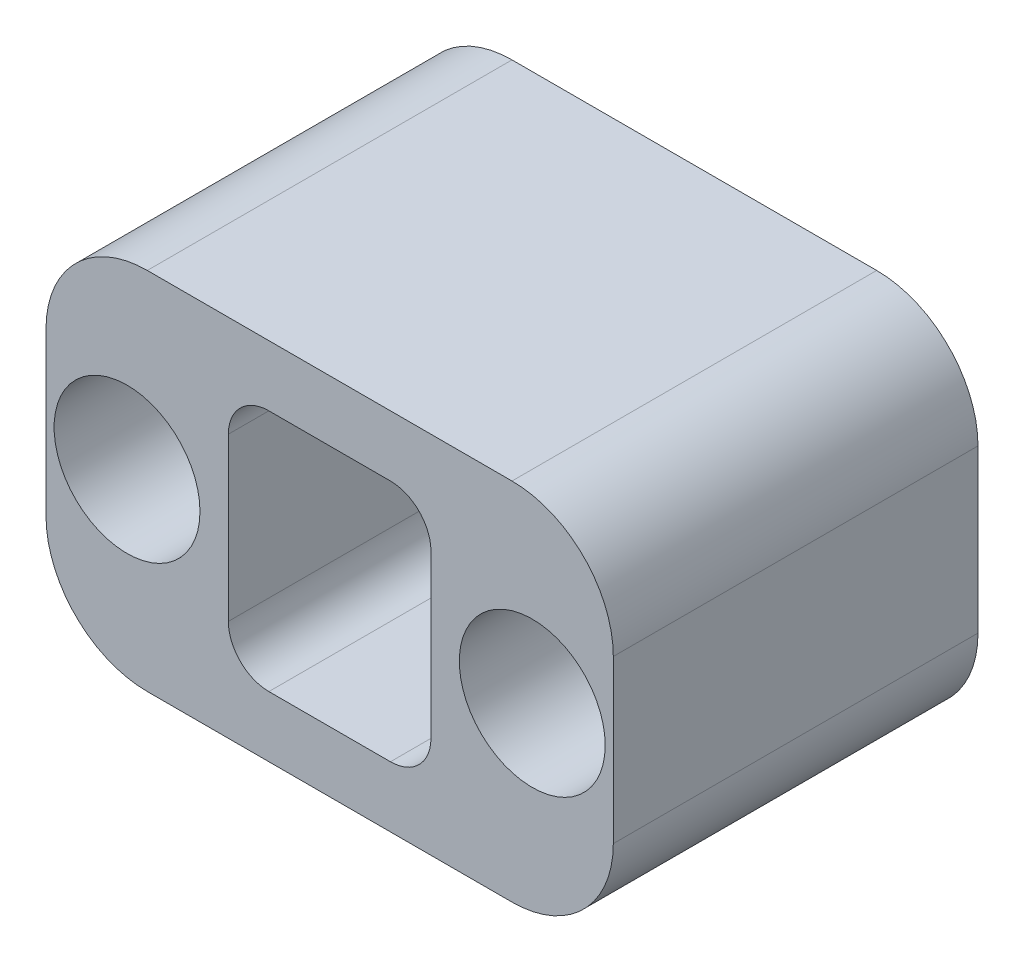
ISO-10303-21;
HEADER;
FILE_DESCRIPTION(('STEP AP214'),'2;1');
FILE_NAME('part.step','',(''),(''),'','','');
FILE_SCHEMA(('AUTOMOTIVE_DESIGN { 1 0 10303 214 1 1 1 1 }'));
ENDSEC;
DATA;
#1=APPLICATION_CONTEXT('core data for automotive mechanical design processes');
#2=APPLICATION_PROTOCOL_DEFINITION('international standard','automotive_design',2000,#1);
#3=PRODUCT_CONTEXT('',#1,'mechanical');
#4=PRODUCT('Part','Part','',(#3));
#5=PRODUCT_RELATED_PRODUCT_CATEGORY('part','',(#4));
#6=PRODUCT_DEFINITION_FORMATION('','',#4);
#7=PRODUCT_DEFINITION_CONTEXT('part definition',#1,'design');
#8=PRODUCT_DEFINITION('design','',#6,#7);
#9=PRODUCT_DEFINITION_SHAPE('','',#8);
#10=(LENGTH_UNIT() NAMED_UNIT(*) SI_UNIT(.MILLI.,.METRE.));
#11=(NAMED_UNIT(*) PLANE_ANGLE_UNIT() SI_UNIT($,.RADIAN.));
#12=(NAMED_UNIT(*) SI_UNIT($,.STERADIAN.) SOLID_ANGLE_UNIT());
#13=UNCERTAINTY_MEASURE_WITH_UNIT(LENGTH_MEASURE(1.E-05),#10,'distance_accuracy_value','');
#14=(GEOMETRIC_REPRESENTATION_CONTEXT(3) GLOBAL_UNCERTAINTY_ASSIGNED_CONTEXT((#13)) GLOBAL_UNIT_ASSIGNED_CONTEXT((#10,
#11,#12)) REPRESENTATION_CONTEXT('',''));
#15=CARTESIAN_POINT('',(0.,0.,0.));
#16=DIRECTION('',(0.,0.,1.));
#17=DIRECTION('',(1.,0.,0.));
#18=AXIS2_PLACEMENT_3D('',#15,#16,#17);
#19=CARTESIAN_POINT('',(-10.,0.,18.));
#20=DIRECTION('',(0.,0.,-1.));
#21=DIRECTION('',(-1.,0.,0.));
#22=AXIS2_PLACEMENT_3D('',#19,#20,#21);
#23=CYLINDRICAL_SURFACE('',#22,2.1);
#24=CARTESIAN_POINT('',(-10.,0.,0.));
#25=DIRECTION('',(0.,0.,1.));
#26=DIRECTION('',(1.,0.,0.));
#27=AXIS2_PLACEMENT_3D('',#24,#25,#26);
#28=CIRCLE('',#27,2.1);
#29=CARTESIAN_POINT('',(-7.9,0.,0.));
#30=VERTEX_POINT('',#29);
#31=EDGE_CURVE('E237',#30,#30,#28,.T.);
#32=ORIENTED_EDGE('',*,*,#31,.F.);
#33=EDGE_LOOP('',(#32));
#34=FACE_BOUND('',#33,.T.);
#35=CARTESIAN_POINT('',(-10.,0.,3.));
#36=DIRECTION('',(0.,0.,1.));
#37=DIRECTION('',(1.,0.,0.));
#38=AXIS2_PLACEMENT_3D('',#35,#36,#37);
#39=CIRCLE('',#38,2.1);
#40=CARTESIAN_POINT('',(-7.9,0.,3.));
#41=VERTEX_POINT('',#40);
#42=EDGE_CURVE('E247',#41,#41,#39,.T.);
#43=ORIENTED_EDGE('',*,*,#42,.T.);
#44=EDGE_LOOP('',(#43));
#45=FACE_BOUND('',#44,.T.);
#46=ADVANCED_FACE('F35',(#34,#45),#23,.F.);
#47=CARTESIAN_POINT('',(10.,0.,18.));
#48=DIRECTION('',(0.,0.,-1.));
#49=DIRECTION('',(-1.,0.,0.));
#50=AXIS2_PLACEMENT_3D('',#47,#48,#49);
#51=CYLINDRICAL_SURFACE('',#50,2.1);
#52=CARTESIAN_POINT('',(10.,0.,0.));
#53=DIRECTION('',(0.,0.,1.));
#54=DIRECTION('',(1.,0.,0.));
#55=AXIS2_PLACEMENT_3D('',#52,#53,#54);
#56=CIRCLE('',#55,2.1);
#57=CARTESIAN_POINT('',(12.1,0.,0.));
#58=VERTEX_POINT('',#57);
#59=EDGE_CURVE('E251',#58,#58,#56,.T.);
#60=ORIENTED_EDGE('',*,*,#59,.F.);
#61=EDGE_LOOP('',(#60));
#62=FACE_BOUND('',#61,.T.);
#63=CARTESIAN_POINT('',(10.,0.,3.));
#64=DIRECTION('',(0.,0.,1.));
#65=DIRECTION('',(1.,0.,0.));
#66=AXIS2_PLACEMENT_3D('',#63,#64,#65);
#67=CIRCLE('',#66,2.1);
#68=CARTESIAN_POINT('',(12.1,0.,3.));
#69=VERTEX_POINT('',#68);
#70=EDGE_CURVE('E244',#69,#69,#67,.T.);
#71=ORIENTED_EDGE('',*,*,#70,.T.);
#72=EDGE_LOOP('',(#71));
#73=FACE_BOUND('',#72,.T.);
#74=ADVANCED_FACE('F352',(#62,#73),#51,.F.);
#75=CARTESIAN_POINT('',(0.,0.,18.));
#76=DIRECTION('',(0.,0.,-1.));
#77=DIRECTION('',(-1.,0.,0.));
#78=AXIS2_PLACEMENT_3D('',#75,#76,#77);
#79=PLANE('',#78);
#80=DIRECTION('',(-1.,0.,0.));
#81=VECTOR('',#80,1.);
#82=CARTESIAN_POINT('',(-5.,6.,18.));
#83=LINE('',#82,#81);
#84=CARTESIAN_POINT('',(3.,6.,18.));
#85=VERTEX_POINT('',#84);
#86=CARTESIAN_POINT('',(-3.,6.,18.));
#87=VERTEX_POINT('',#86);
#88=EDGE_CURVE('E295',#85,#87,#83,.T.);
#89=ORIENTED_EDGE('',*,*,#88,.F.);
#90=CARTESIAN_POINT('',(3.,4.,18.));
#91=DIRECTION('',(0.,0.,-1.));
#92=DIRECTION('',(-1.,0.,0.));
#93=AXIS2_PLACEMENT_3D('',#90,#91,#92);
#94=CIRCLE('',#93,2.);
#95=CARTESIAN_POINT('',(5.,4.,18.));
#96=VERTEX_POINT('',#95);
#97=EDGE_CURVE('E178',#85,#96,#94,.T.);
#98=ORIENTED_EDGE('',*,*,#97,.T.);
#99=DIRECTION('',(0.,1.,0.));
#100=VECTOR('',#99,1.);
#101=CARTESIAN_POINT('',(5.,-6.,18.));
#102=LINE('',#101,#100);
#103=CARTESIAN_POINT('',(5.,-4.,18.));
#104=VERTEX_POINT('',#103);
#105=EDGE_CURVE('E157',#104,#96,#102,.T.);
#106=ORIENTED_EDGE('',*,*,#105,.F.);
#107=CARTESIAN_POINT('',(3.,-4.,18.));
#108=DIRECTION('',(0.,0.,-1.));
#109=DIRECTION('',(-1.,0.,0.));
#110=AXIS2_PLACEMENT_3D('',#107,#108,#109);
#111=CIRCLE('',#110,2.);
#112=CARTESIAN_POINT('',(3.,-6.,18.));
#113=VERTEX_POINT('',#112);
#114=EDGE_CURVE('E274',#104,#113,#111,.T.);
#115=ORIENTED_EDGE('',*,*,#114,.T.);
#116=DIRECTION('',(1.,0.,0.));
#117=VECTOR('',#116,1.);
#118=CARTESIAN_POINT('',(-5.,-6.,18.));
#119=LINE('',#118,#117);
#120=CARTESIAN_POINT('',(-3.,-6.,18.));
#121=VERTEX_POINT('',#120);
#122=EDGE_CURVE('E300',#121,#113,#119,.T.);
#123=ORIENTED_EDGE('',*,*,#122,.F.);
#124=CARTESIAN_POINT('',(-3.,-4.,18.));
#125=DIRECTION('',(0.,0.,-1.));
#126=DIRECTION('',(-1.,0.,0.));
#127=AXIS2_PLACEMENT_3D('',#124,#125,#126);
#128=CIRCLE('',#127,2.);
#129=CARTESIAN_POINT('',(-5.,-4.,18.));
#130=VERTEX_POINT('',#129);
#131=EDGE_CURVE('E177',#121,#130,#128,.T.);
#132=ORIENTED_EDGE('',*,*,#131,.T.);
#133=DIRECTION('',(0.,-1.,0.));
#134=VECTOR('',#133,1.);
#135=CARTESIAN_POINT('',(-5.,-6.,18.));
#136=LINE('',#135,#134);
#137=CARTESIAN_POINT('',(-5.,4.,18.));
#138=VERTEX_POINT('',#137);
#139=EDGE_CURVE('E296',#138,#130,#136,.T.);
#140=ORIENTED_EDGE('',*,*,#139,.F.);
#141=CARTESIAN_POINT('',(-3.,4.,18.));
#142=DIRECTION('',(0.,0.,-1.));
#143=DIRECTION('',(-1.,0.,0.));
#144=AXIS2_PLACEMENT_3D('',#141,#142,#143);
#145=CIRCLE('',#144,2.);
#146=EDGE_CURVE('E277',#138,#87,#145,.T.);
#147=ORIENTED_EDGE('',*,*,#146,.T.);
#148=EDGE_LOOP('',(#89,#98,#106,#115,#123,#132,#140,#147));
#149=FACE_BOUND('',#148,.T.);
#150=CARTESIAN_POINT('',(-10.,0.,18.));
#151=DIRECTION('',(0.,0.,1.));
#152=DIRECTION('',(1.,0.,0.));
#153=AXIS2_PLACEMENT_3D('',#150,#151,#152);
#154=CIRCLE('',#153,3.6);
#155=CARTESIAN_POINT('',(-6.4,0.,18.));
#156=VERTEX_POINT('',#155);
#157=EDGE_CURVE('E309',#156,#156,#154,.T.);
#158=ORIENTED_EDGE('',*,*,#157,.F.);
#159=EDGE_LOOP('',(#158));
#160=FACE_BOUND('',#159,.T.);
#161=CARTESIAN_POINT('',(10.,0.,18.));
#162=DIRECTION('',(0.,0.,1.));
#163=DIRECTION('',(1.,0.,0.));
#164=AXIS2_PLACEMENT_3D('',#161,#162,#163);
#165=CIRCLE('',#164,3.6);
#166=CARTESIAN_POINT('',(13.6,0.,18.));
#167=VERTEX_POINT('',#166);
#168=EDGE_CURVE('E306',#167,#167,#165,.T.);
#169=ORIENTED_EDGE('',*,*,#168,.F.);
#170=EDGE_LOOP('',(#169));
#171=FACE_BOUND('',#170,.T.);
#172=DIRECTION('',(1.,0.,0.));
#173=VECTOR('',#172,1.);
#174=CARTESIAN_POINT('',(-14.,-9.,18.));
#175=LINE('',#174,#173);
#176=CARTESIAN_POINT('',(-9.,-9.,18.));
#177=VERTEX_POINT('',#176);
#178=CARTESIAN_POINT('',(9.00000000000001,-9.,18.));
#179=VERTEX_POINT('',#178);
#180=EDGE_CURVE('E255',#177,#179,#175,.T.);
#181=ORIENTED_EDGE('',*,*,#180,.T.);
#182=CARTESIAN_POINT('',(9.00000000000001,-4.,18.));
#183=DIRECTION('',(0.,0.,-1.));
#184=DIRECTION('',(-1.,0.,0.));
#185=AXIS2_PLACEMENT_3D('',#182,#183,#184);
#186=CIRCLE('',#185,5.);
#187=CARTESIAN_POINT('',(14.,-4.,18.));
#188=VERTEX_POINT('',#187);
#189=EDGE_CURVE('E210',#179,#188,#186,.F.);
#190=ORIENTED_EDGE('',*,*,#189,.T.);
#191=DIRECTION('',(0.,1.,0.));
#192=VECTOR('',#191,1.);
#193=CARTESIAN_POINT('',(14.,-9.,18.));
#194=LINE('',#193,#192);
#195=CARTESIAN_POINT('',(14.,4.,18.));
#196=VERTEX_POINT('',#195);
#197=EDGE_CURVE('E243',#188,#196,#194,.T.);
#198=ORIENTED_EDGE('',*,*,#197,.T.);
#199=CARTESIAN_POINT('',(9.00000000000001,4.,18.));
#200=DIRECTION('',(0.,0.,-1.));
#201=DIRECTION('',(-1.,0.,0.));
#202=AXIS2_PLACEMENT_3D('',#199,#200,#201);
#203=CIRCLE('',#202,5.);
#204=CARTESIAN_POINT('',(9.00000000000001,9.,18.));
#205=VERTEX_POINT('',#204);
#206=EDGE_CURVE('E205',#196,#205,#203,.F.);
#207=ORIENTED_EDGE('',*,*,#206,.T.);
#208=DIRECTION('',(-1.,0.,0.));
#209=VECTOR('',#208,1.);
#210=CARTESIAN_POINT('',(-14.,9.,18.));
#211=LINE('',#210,#209);
#212=CARTESIAN_POINT('',(-9.,9.,18.));
#213=VERTEX_POINT('',#212);
#214=EDGE_CURVE('E224',#205,#213,#211,.T.);
#215=ORIENTED_EDGE('',*,*,#214,.T.);
#216=CARTESIAN_POINT('',(-9.,4.,18.));
#217=DIRECTION('',(0.,0.,-1.));
#218=DIRECTION('',(-1.,0.,0.));
#219=AXIS2_PLACEMENT_3D('',#216,#217,#218);
#220=CIRCLE('',#219,5.);
#221=CARTESIAN_POINT('',(-14.,4.,18.));
#222=VERTEX_POINT('',#221);
#223=EDGE_CURVE('E57',#213,#222,#220,.F.);
#224=ORIENTED_EDGE('',*,*,#223,.T.);
#225=DIRECTION('',(0.,-1.,0.));
#226=VECTOR('',#225,1.);
#227=CARTESIAN_POINT('',(-14.,-9.,18.));
#228=LINE('',#227,#226);
#229=CARTESIAN_POINT('',(-14.,-4.,18.));
#230=VERTEX_POINT('',#229);
#231=EDGE_CURVE('E324',#222,#230,#228,.T.);
#232=ORIENTED_EDGE('',*,*,#231,.T.);
#233=CARTESIAN_POINT('',(-9.,-4.,18.));
#234=DIRECTION('',(0.,0.,-1.));
#235=DIRECTION('',(-1.,0.,0.));
#236=AXIS2_PLACEMENT_3D('',#233,#234,#235);
#237=CIRCLE('',#236,5.);
#238=EDGE_CURVE('E208',#230,#177,#237,.F.);
#239=ORIENTED_EDGE('',*,*,#238,.T.);
#240=EDGE_LOOP('',(#181,#190,#198,#207,#215,#224,#232,#239));
#241=FACE_BOUND('',#240,.T.);
#242=ADVANCED_FACE('F293',(#149,#160,#171,#241),#79,.F.);
#243=CARTESIAN_POINT('',(0.,0.,0.));
#244=DIRECTION('',(0.,0.,-1.));
#245=DIRECTION('',(-1.,0.,0.));
#246=AXIS2_PLACEMENT_3D('',#243,#244,#245);
#247=PLANE('',#246);
#248=DIRECTION('',(0.,-1.,0.));
#249=VECTOR('',#248,1.);
#250=CARTESIAN_POINT('',(5.,0.,0.));
#251=LINE('',#250,#249);
#252=CARTESIAN_POINT('',(5.,4.,0.));
#253=VERTEX_POINT('',#252);
#254=CARTESIAN_POINT('',(5.,-4.,0.));
#255=VERTEX_POINT('',#254);
#256=EDGE_CURVE('E154',#253,#255,#251,.T.);
#257=ORIENTED_EDGE('',*,*,#256,.F.);
#258=CARTESIAN_POINT('',(3.,4.,0.));
#259=DIRECTION('',(0.,0.,-1.));
#260=DIRECTION('',(-1.,0.,0.));
#261=AXIS2_PLACEMENT_3D('',#258,#259,#260);
#262=CIRCLE('',#261,2.);
#263=CARTESIAN_POINT('',(3.,6.,0.));
#264=VERTEX_POINT('',#263);
#265=EDGE_CURVE('E166',#253,#264,#262,.F.);
#266=ORIENTED_EDGE('',*,*,#265,.T.);
#267=DIRECTION('',(1.,0.,0.));
#268=VECTOR('',#267,1.);
#269=CARTESIAN_POINT('',(0.,6.,0.));
#270=LINE('',#269,#268);
#271=CARTESIAN_POINT('',(-3.,6.,0.));
#272=VERTEX_POINT('',#271);
#273=EDGE_CURVE('E252',#272,#264,#270,.T.);
#274=ORIENTED_EDGE('',*,*,#273,.F.);
#275=CARTESIAN_POINT('',(-3.,4.,0.));
#276=DIRECTION('',(0.,0.,-1.));
#277=DIRECTION('',(-1.,0.,0.));
#278=AXIS2_PLACEMENT_3D('',#275,#276,#277);
#279=CIRCLE('',#278,2.);
#280=CARTESIAN_POINT('',(-5.,4.,0.));
#281=VERTEX_POINT('',#280);
#282=EDGE_CURVE('E182',#272,#281,#279,.F.);
#283=ORIENTED_EDGE('',*,*,#282,.T.);
#284=DIRECTION('',(0.,1.,0.));
#285=VECTOR('',#284,1.);
#286=CARTESIAN_POINT('',(-5.,0.,0.));
#287=LINE('',#286,#285);
#288=CARTESIAN_POINT('',(-5.,-4.,0.));
#289=VERTEX_POINT('',#288);
#290=EDGE_CURVE('E254',#289,#281,#287,.T.);
#291=ORIENTED_EDGE('',*,*,#290,.F.);
#292=CARTESIAN_POINT('',(-3.,-4.,0.));
#293=DIRECTION('',(0.,0.,-1.));
#294=DIRECTION('',(-1.,0.,0.));
#295=AXIS2_PLACEMENT_3D('',#292,#293,#294);
#296=CIRCLE('',#295,2.);
#297=CARTESIAN_POINT('',(-3.,-6.,0.));
#298=VERTEX_POINT('',#297);
#299=EDGE_CURVE('E180',#289,#298,#296,.F.);
#300=ORIENTED_EDGE('',*,*,#299,.T.);
#301=DIRECTION('',(-1.,0.,0.));
#302=VECTOR('',#301,1.);
#303=CARTESIAN_POINT('',(0.,-6.,0.));
#304=LINE('',#303,#302);
#305=CARTESIAN_POINT('',(3.,-6.,0.));
#306=VERTEX_POINT('',#305);
#307=EDGE_CURVE('E171',#306,#298,#304,.T.);
#308=ORIENTED_EDGE('',*,*,#307,.F.);
#309=CARTESIAN_POINT('',(3.,-4.,0.));
#310=DIRECTION('',(0.,0.,-1.));
#311=DIRECTION('',(-1.,0.,0.));
#312=AXIS2_PLACEMENT_3D('',#309,#310,#311);
#313=CIRCLE('',#312,2.);
#314=EDGE_CURVE('E170',#306,#255,#313,.F.);
#315=ORIENTED_EDGE('',*,*,#314,.T.);
#316=EDGE_LOOP('',(#257,#266,#274,#283,#291,#300,#308,#315));
#317=FACE_BOUND('',#316,.T.);
#318=ORIENTED_EDGE('',*,*,#31,.T.);
#319=EDGE_LOOP('',(#318));
#320=FACE_BOUND('',#319,.T.);
#321=DIRECTION('',(0.,1.,0.));
#322=VECTOR('',#321,1.);
#323=CARTESIAN_POINT('',(14.,-9.,0.));
#324=LINE('',#323,#322);
#325=CARTESIAN_POINT('',(14.,-4.,0.));
#326=VERTEX_POINT('',#325);
#327=CARTESIAN_POINT('',(14.,4.,0.));
#328=VERTEX_POINT('',#327);
#329=EDGE_CURVE('E233',#326,#328,#324,.T.);
#330=ORIENTED_EDGE('',*,*,#329,.F.);
#331=CARTESIAN_POINT('',(9.00000000000001,-4.,0.));
#332=DIRECTION('',(0.,0.,-1.));
#333=DIRECTION('',(-1.,0.,0.));
#334=AXIS2_PLACEMENT_3D('',#331,#332,#333);
#335=CIRCLE('',#334,5.);
#336=CARTESIAN_POINT('',(9.00000000000001,-9.,0.));
#337=VERTEX_POINT('',#336);
#338=EDGE_CURVE('E198',#326,#337,#335,.T.);
#339=ORIENTED_EDGE('',*,*,#338,.T.);
#340=DIRECTION('',(1.,0.,0.));
#341=VECTOR('',#340,1.);
#342=CARTESIAN_POINT('',(-14.,-9.,0.));
#343=LINE('',#342,#341);
#344=CARTESIAN_POINT('',(-9.,-9.,0.));
#345=VERTEX_POINT('',#344);
#346=EDGE_CURVE('E235',#345,#337,#343,.T.);
#347=ORIENTED_EDGE('',*,*,#346,.F.);
#348=CARTESIAN_POINT('',(-9.,-4.,0.));
#349=DIRECTION('',(0.,0.,-1.));
#350=DIRECTION('',(-1.,0.,0.));
#351=AXIS2_PLACEMENT_3D('',#348,#349,#350);
#352=CIRCLE('',#351,5.);
#353=CARTESIAN_POINT('',(-14.,-4.,0.));
#354=VERTEX_POINT('',#353);
#355=EDGE_CURVE('E196',#345,#354,#352,.T.);
#356=ORIENTED_EDGE('',*,*,#355,.T.);
#357=DIRECTION('',(0.,-1.,0.));
#358=VECTOR('',#357,1.);
#359=CARTESIAN_POINT('',(-14.,-9.,0.));
#360=LINE('',#359,#358);
#361=CARTESIAN_POINT('',(-14.,4.,0.));
#362=VERTEX_POINT('',#361);
#363=EDGE_CURVE('E232',#362,#354,#360,.T.);
#364=ORIENTED_EDGE('',*,*,#363,.F.);
#365=CARTESIAN_POINT('',(-9.,4.,0.));
#366=DIRECTION('',(0.,0.,-1.));
#367=DIRECTION('',(-1.,0.,0.));
#368=AXIS2_PLACEMENT_3D('',#365,#366,#367);
#369=CIRCLE('',#368,5.);
#370=CARTESIAN_POINT('',(-9.,9.,0.));
#371=VERTEX_POINT('',#370);
#372=EDGE_CURVE('E194',#362,#371,#369,.T.);
#373=ORIENTED_EDGE('',*,*,#372,.T.);
#374=DIRECTION('',(-1.,0.,0.));
#375=VECTOR('',#374,1.);
#376=CARTESIAN_POINT('',(-14.,9.,0.));
#377=LINE('',#376,#375);
#378=CARTESIAN_POINT('',(9.00000000000001,9.,0.));
#379=VERTEX_POINT('',#378);
#380=EDGE_CURVE('E222',#379,#371,#377,.T.);
#381=ORIENTED_EDGE('',*,*,#380,.F.);
#382=CARTESIAN_POINT('',(9.00000000000001,4.,0.));
#383=DIRECTION('',(0.,0.,-1.));
#384=DIRECTION('',(-1.,0.,0.));
#385=AXIS2_PLACEMENT_3D('',#382,#383,#384);
#386=CIRCLE('',#385,5.);
#387=EDGE_CURVE('E192',#379,#328,#386,.T.);
#388=ORIENTED_EDGE('',*,*,#387,.T.);
#389=EDGE_LOOP('',(#330,#339,#347,#356,#364,#373,#381,#388));
#390=FACE_BOUND('',#389,.T.);
#391=ORIENTED_EDGE('',*,*,#59,.T.);
#392=EDGE_LOOP('',(#391));
#393=FACE_BOUND('',#392,.T.);
#394=ADVANCED_FACE('F163',(#317,#320,#390,#393),#247,.T.);
#395=CARTESIAN_POINT('',(14.,-9.,18.));
#396=DIRECTION('',(-1.,0.,0.));
#397=DIRECTION('',(0.,0.,1.));
#398=AXIS2_PLACEMENT_3D('',#395,#396,#397);
#399=PLANE('',#398);
#400=ORIENTED_EDGE('',*,*,#197,.F.);
#401=DIRECTION('',(0.,0.,-1.));
#402=VECTOR('',#401,1.);
#403=CARTESIAN_POINT('',(14.,-4.,18.));
#404=LINE('',#403,#402);
#405=EDGE_CURVE('E189',#188,#326,#404,.T.);
#406=ORIENTED_EDGE('',*,*,#405,.T.);
#407=ORIENTED_EDGE('',*,*,#329,.T.);
#408=DIRECTION('',(0.,0.,-1.));
#409=VECTOR('',#408,1.);
#410=CARTESIAN_POINT('',(14.,4.,18.));
#411=LINE('',#410,#409);
#412=EDGE_CURVE('E187',#328,#196,#411,.F.);
#413=ORIENTED_EDGE('',*,*,#412,.T.);
#414=EDGE_LOOP('',(#400,#406,#407,#413));
#415=FACE_BOUND('',#414,.T.);
#416=ADVANCED_FACE('F337',(#415),#399,.F.);
#417=CARTESIAN_POINT('',(-14.,9.,18.));
#418=DIRECTION('',(0.,-1.,0.));
#419=DIRECTION('',(1.,0.,0.));
#420=AXIS2_PLACEMENT_3D('',#417,#418,#419);
#421=PLANE('',#420);
#422=ORIENTED_EDGE('',*,*,#380,.T.);
#423=DIRECTION('',(0.,0.,-1.));
#424=VECTOR('',#423,1.);
#425=CARTESIAN_POINT('',(-9.,9.,18.));
#426=LINE('',#425,#424);
#427=EDGE_CURVE('E11',#371,#213,#426,.F.);
#428=ORIENTED_EDGE('',*,*,#427,.T.);
#429=ORIENTED_EDGE('',*,*,#214,.F.);
#430=DIRECTION('',(0.,0.,-1.));
#431=VECTOR('',#430,1.);
#432=CARTESIAN_POINT('',(9.00000000000001,9.,18.));
#433=LINE('',#432,#431);
#434=EDGE_CURVE('E43',#205,#379,#433,.T.);
#435=ORIENTED_EDGE('',*,*,#434,.T.);
#436=EDGE_LOOP('',(#422,#428,#429,#435));
#437=FACE_BOUND('',#436,.T.);
#438=ADVANCED_FACE('F221',(#437),#421,.F.);
#439=CARTESIAN_POINT('',(-14.,-9.,18.));
#440=DIRECTION('',(1.,0.,0.));
#441=DIRECTION('',(0.,0.,-1.));
#442=AXIS2_PLACEMENT_3D('',#439,#440,#441);
#443=PLANE('',#442);
#444=ORIENTED_EDGE('',*,*,#363,.T.);
#445=DIRECTION('',(0.,0.,-1.));
#446=VECTOR('',#445,1.);
#447=CARTESIAN_POINT('',(-14.,-4.,18.));
#448=LINE('',#447,#446);
#449=EDGE_CURVE('E50',#354,#230,#448,.F.);
#450=ORIENTED_EDGE('',*,*,#449,.T.);
#451=ORIENTED_EDGE('',*,*,#231,.F.);
#452=DIRECTION('',(0.,0.,-1.));
#453=VECTOR('',#452,1.);
#454=CARTESIAN_POINT('',(-14.,4.,18.));
#455=LINE('',#454,#453);
#456=EDGE_CURVE('E212',#222,#362,#455,.T.);
#457=ORIENTED_EDGE('',*,*,#456,.T.);
#458=EDGE_LOOP('',(#444,#450,#451,#457));
#459=FACE_BOUND('',#458,.T.);
#460=ADVANCED_FACE('F343',(#459),#443,.F.);
#461=CARTESIAN_POINT('',(-14.,-9.,18.));
#462=DIRECTION('',(0.,1.,0.));
#463=DIRECTION('',(-1.,0.,0.));
#464=AXIS2_PLACEMENT_3D('',#461,#462,#463);
#465=PLANE('',#464);
#466=ORIENTED_EDGE('',*,*,#346,.T.);
#467=DIRECTION('',(0.,0.,-1.));
#468=VECTOR('',#467,1.);
#469=CARTESIAN_POINT('',(9.00000000000001,-9.,18.));
#470=LINE('',#469,#468);
#471=EDGE_CURVE('E203',#337,#179,#470,.F.);
#472=ORIENTED_EDGE('',*,*,#471,.T.);
#473=ORIENTED_EDGE('',*,*,#180,.F.);
#474=DIRECTION('',(0.,0.,-1.));
#475=VECTOR('',#474,1.);
#476=CARTESIAN_POINT('',(-9.,-9.,18.));
#477=LINE('',#476,#475);
#478=EDGE_CURVE('E200',#177,#345,#477,.T.);
#479=ORIENTED_EDGE('',*,*,#478,.T.);
#480=EDGE_LOOP('',(#466,#472,#473,#479));
#481=FACE_BOUND('',#480,.T.);
#482=ADVANCED_FACE('F340',(#481),#465,.F.);
#483=CARTESIAN_POINT('',(10.,0.,3.));
#484=DIRECTION('',(0.,0.,1.));
#485=DIRECTION('',(1.,0.,0.));
#486=AXIS2_PLACEMENT_3D('',#483,#484,#485);
#487=CYLINDRICAL_SURFACE('',#486,3.6);
#488=CARTESIAN_POINT('',(10.,0.,3.));
#489=DIRECTION('',(0.,0.,1.));
#490=DIRECTION('',(1.,0.,0.));
#491=AXIS2_PLACEMENT_3D('',#488,#489,#490);
#492=CIRCLE('',#491,3.6);
#493=CARTESIAN_POINT('',(13.6,0.,3.));
#494=VERTEX_POINT('',#493);
#495=EDGE_CURVE('E312',#494,#494,#492,.T.);
#496=ORIENTED_EDGE('',*,*,#495,.F.);
#497=EDGE_LOOP('',(#496));
#498=FACE_BOUND('',#497,.T.);
#499=ORIENTED_EDGE('',*,*,#168,.T.);
#500=EDGE_LOOP('',(#499));
#501=FACE_BOUND('',#500,.T.);
#502=ADVANCED_FACE('F370',(#498,#501),#487,.F.);
#503=CARTESIAN_POINT('',(10.,0.,3.));
#504=DIRECTION('',(0.,0.,1.));
#505=DIRECTION('',(1.,0.,0.));
#506=AXIS2_PLACEMENT_3D('',#503,#504,#505);
#507=PLANE('',#506);
#508=ORIENTED_EDGE('',*,*,#70,.F.);
#509=EDGE_LOOP('',(#508));
#510=FACE_BOUND('',#509,.T.);
#511=ORIENTED_EDGE('',*,*,#495,.T.);
#512=EDGE_LOOP('',(#511));
#513=FACE_BOUND('',#512,.T.);
#514=ADVANCED_FACE('F482',(#510,#513),#507,.T.);
#515=CARTESIAN_POINT('',(-10.,0.,3.));
#516=DIRECTION('',(0.,0.,1.));
#517=DIRECTION('',(1.,0.,0.));
#518=AXIS2_PLACEMENT_3D('',#515,#516,#517);
#519=CYLINDRICAL_SURFACE('',#518,3.6);
#520=CARTESIAN_POINT('',(-10.,0.,3.));
#521=DIRECTION('',(0.,0.,1.));
#522=DIRECTION('',(1.,0.,0.));
#523=AXIS2_PLACEMENT_3D('',#520,#521,#522);
#524=CIRCLE('',#523,3.6);
#525=CARTESIAN_POINT('',(-6.4,0.,3.));
#526=VERTEX_POINT('',#525);
#527=EDGE_CURVE('E248',#526,#526,#524,.T.);
#528=ORIENTED_EDGE('',*,*,#527,.F.);
#529=EDGE_LOOP('',(#528));
#530=FACE_BOUND('',#529,.T.);
#531=ORIENTED_EDGE('',*,*,#157,.T.);
#532=EDGE_LOOP('',(#531));
#533=FACE_BOUND('',#532,.T.);
#534=ADVANCED_FACE('F473',(#530,#533),#519,.F.);
#535=CARTESIAN_POINT('',(-10.,0.,3.));
#536=DIRECTION('',(0.,0.,1.));
#537=DIRECTION('',(1.,0.,0.));
#538=AXIS2_PLACEMENT_3D('',#535,#536,#537);
#539=PLANE('',#538);
#540=ORIENTED_EDGE('',*,*,#42,.F.);
#541=EDGE_LOOP('',(#540));
#542=FACE_BOUND('',#541,.T.);
#543=ORIENTED_EDGE('',*,*,#527,.T.);
#544=EDGE_LOOP('',(#543));
#545=FACE_BOUND('',#544,.T.);
#546=ADVANCED_FACE('F465',(#542,#545),#539,.T.);
#547=CARTESIAN_POINT('',(5.,-6.,-7.));
#548=DIRECTION('',(1.,0.,0.));
#549=DIRECTION('',(0.,0.,-1.));
#550=AXIS2_PLACEMENT_3D('',#547,#548,#549);
#551=PLANE('',#550);
#552=ORIENTED_EDGE('',*,*,#256,.T.);
#553=DIRECTION('',(0.,0.,1.));
#554=VECTOR('',#553,1.);
#555=CARTESIAN_POINT('',(5.,-4.,18.));
#556=LINE('',#555,#554);
#557=EDGE_CURVE('E160',#255,#104,#556,.T.);
#558=ORIENTED_EDGE('',*,*,#557,.T.);
#559=ORIENTED_EDGE('',*,*,#105,.T.);
#560=DIRECTION('',(0.,0.,1.));
#561=VECTOR('',#560,1.);
#562=CARTESIAN_POINT('',(5.,4.,0.));
#563=LINE('',#562,#561);
#564=EDGE_CURVE('E150',#96,#253,#563,.F.);
#565=ORIENTED_EDGE('',*,*,#564,.T.);
#566=EDGE_LOOP('',(#552,#558,#559,#565));
#567=FACE_BOUND('',#566,.T.);
#568=ADVANCED_FACE('F152',(#567),#551,.F.);
#569=CARTESIAN_POINT('',(-5.,-6.,-7.));
#570=DIRECTION('',(0.,-1.,0.));
#571=DIRECTION('',(0.,0.,-1.));
#572=AXIS2_PLACEMENT_3D('',#569,#570,#571);
#573=PLANE('',#572);
#574=ORIENTED_EDGE('',*,*,#122,.T.);
#575=DIRECTION('',(0.,0.,1.));
#576=VECTOR('',#575,1.);
#577=CARTESIAN_POINT('',(3.,-6.,0.));
#578=LINE('',#577,#576);
#579=EDGE_CURVE('E264',#113,#306,#578,.F.);
#580=ORIENTED_EDGE('',*,*,#579,.T.);
#581=ORIENTED_EDGE('',*,*,#307,.T.);
#582=DIRECTION('',(0.,0.,1.));
#583=VECTOR('',#582,1.);
#584=CARTESIAN_POINT('',(-3.,-6.,18.));
#585=LINE('',#584,#583);
#586=EDGE_CURVE('E261',#298,#121,#585,.T.);
#587=ORIENTED_EDGE('',*,*,#586,.T.);
#588=EDGE_LOOP('',(#574,#580,#581,#587));
#589=FACE_BOUND('',#588,.T.);
#590=ADVANCED_FACE('F449',(#589),#573,.F.);
#591=CARTESIAN_POINT('',(-5.,-6.,-7.));
#592=DIRECTION('',(-1.,0.,0.));
#593=DIRECTION('',(0.,0.,1.));
#594=AXIS2_PLACEMENT_3D('',#591,#592,#593);
#595=PLANE('',#594);
#596=ORIENTED_EDGE('',*,*,#290,.T.);
#597=DIRECTION('',(0.,0.,1.));
#598=VECTOR('',#597,1.);
#599=CARTESIAN_POINT('',(-5.,4.,18.));
#600=LINE('',#599,#598);
#601=EDGE_CURVE('E268',#281,#138,#600,.T.);
#602=ORIENTED_EDGE('',*,*,#601,.T.);
#603=ORIENTED_EDGE('',*,*,#139,.T.);
#604=DIRECTION('',(0.,0.,1.));
#605=VECTOR('',#604,1.);
#606=CARTESIAN_POINT('',(-5.,-4.,0.));
#607=LINE('',#606,#605);
#608=EDGE_CURVE('E266',#130,#289,#607,.F.);
#609=ORIENTED_EDGE('',*,*,#608,.T.);
#610=EDGE_LOOP('',(#596,#602,#603,#609));
#611=FACE_BOUND('',#610,.T.);
#612=ADVANCED_FACE('F285',(#611),#595,.F.);
#613=CARTESIAN_POINT('',(-5.,6.,-7.));
#614=DIRECTION('',(0.,1.,0.));
#615=DIRECTION('',(0.,0.,1.));
#616=AXIS2_PLACEMENT_3D('',#613,#614,#615);
#617=PLANE('',#616);
#618=ORIENTED_EDGE('',*,*,#88,.T.);
#619=DIRECTION('',(0.,0.,1.));
#620=VECTOR('',#619,1.);
#621=CARTESIAN_POINT('',(-3.,6.,0.));
#622=LINE('',#621,#620);
#623=EDGE_CURVE('E272',#87,#272,#622,.F.);
#624=ORIENTED_EDGE('',*,*,#623,.T.);
#625=ORIENTED_EDGE('',*,*,#273,.T.);
#626=DIRECTION('',(0.,0.,1.));
#627=VECTOR('',#626,1.);
#628=CARTESIAN_POINT('',(3.,6.,18.));
#629=LINE('',#628,#627);
#630=EDGE_CURVE('E176',#264,#85,#629,.T.);
#631=ORIENTED_EDGE('',*,*,#630,.T.);
#632=EDGE_LOOP('',(#618,#624,#625,#631));
#633=FACE_BOUND('',#632,.T.);
#634=ADVANCED_FACE('F298',(#633),#617,.F.);
#635=CARTESIAN_POINT('',(3.,-4.,-7.));
#636=DIRECTION('',(0.,0.,-1.));
#637=DIRECTION('',(-1.,0.,0.));
#638=AXIS2_PLACEMENT_3D('',#635,#636,#637);
#639=CYLINDRICAL_SURFACE('',#638,2.);
#640=ORIENTED_EDGE('',*,*,#314,.F.);
#641=ORIENTED_EDGE('',*,*,#579,.F.);
#642=ORIENTED_EDGE('',*,*,#114,.F.);
#643=ORIENTED_EDGE('',*,*,#557,.F.);
#644=EDGE_LOOP('',(#640,#641,#642,#643));
#645=FACE_BOUND('',#644,.T.);
#646=ADVANCED_FACE('F377',(#645),#639,.F.);
#647=CARTESIAN_POINT('',(-3.,4.,-7.));
#648=DIRECTION('',(0.,0.,-1.));
#649=DIRECTION('',(-1.,0.,0.));
#650=AXIS2_PLACEMENT_3D('',#647,#648,#649);
#651=CYLINDRICAL_SURFACE('',#650,2.);
#652=ORIENTED_EDGE('',*,*,#282,.F.);
#653=ORIENTED_EDGE('',*,*,#623,.F.);
#654=ORIENTED_EDGE('',*,*,#146,.F.);
#655=ORIENTED_EDGE('',*,*,#601,.F.);
#656=EDGE_LOOP('',(#652,#653,#654,#655));
#657=FACE_BOUND('',#656,.T.);
#658=ADVANCED_FACE('F289',(#657),#651,.F.);
#659=CARTESIAN_POINT('',(3.,4.,-7.));
#660=DIRECTION('',(0.,0.,-1.));
#661=DIRECTION('',(-1.,0.,0.));
#662=AXIS2_PLACEMENT_3D('',#659,#660,#661);
#663=CYLINDRICAL_SURFACE('',#662,2.);
#664=ORIENTED_EDGE('',*,*,#265,.F.);
#665=ORIENTED_EDGE('',*,*,#564,.F.);
#666=ORIENTED_EDGE('',*,*,#97,.F.);
#667=ORIENTED_EDGE('',*,*,#630,.F.);
#668=EDGE_LOOP('',(#664,#665,#666,#667));
#669=FACE_BOUND('',#668,.T.);
#670=ADVANCED_FACE('F174',(#669),#663,.F.);
#671=CARTESIAN_POINT('',(-3.,-4.,-7.));
#672=DIRECTION('',(0.,0.,-1.));
#673=DIRECTION('',(-1.,0.,0.));
#674=AXIS2_PLACEMENT_3D('',#671,#672,#673);
#675=CYLINDRICAL_SURFACE('',#674,2.);
#676=ORIENTED_EDGE('',*,*,#299,.F.);
#677=ORIENTED_EDGE('',*,*,#608,.F.);
#678=ORIENTED_EDGE('',*,*,#131,.F.);
#679=ORIENTED_EDGE('',*,*,#586,.F.);
#680=EDGE_LOOP('',(#676,#677,#678,#679));
#681=FACE_BOUND('',#680,.T.);
#682=ADVANCED_FACE('F385',(#681),#675,.F.);
#683=CARTESIAN_POINT('',(9.00000000000001,-4.,18.));
#684=DIRECTION('',(0.,0.,-1.));
#685=DIRECTION('',(-1.,0.,0.));
#686=AXIS2_PLACEMENT_3D('',#683,#684,#685);
#687=CYLINDRICAL_SURFACE('',#686,5.);
#688=ORIENTED_EDGE('',*,*,#189,.F.);
#689=ORIENTED_EDGE('',*,*,#471,.F.);
#690=ORIENTED_EDGE('',*,*,#338,.F.);
#691=ORIENTED_EDGE('',*,*,#405,.F.);
#692=EDGE_LOOP('',(#688,#689,#690,#691));
#693=FACE_BOUND('',#692,.T.);
#694=ADVANCED_FACE('F335',(#693),#687,.T.);
#695=CARTESIAN_POINT('',(-9.,-4.,18.));
#696=DIRECTION('',(0.,0.,-1.));
#697=DIRECTION('',(-1.,0.,0.));
#698=AXIS2_PLACEMENT_3D('',#695,#696,#697);
#699=CYLINDRICAL_SURFACE('',#698,5.);
#700=ORIENTED_EDGE('',*,*,#238,.F.);
#701=ORIENTED_EDGE('',*,*,#449,.F.);
#702=ORIENTED_EDGE('',*,*,#355,.F.);
#703=ORIENTED_EDGE('',*,*,#478,.F.);
#704=EDGE_LOOP('',(#700,#701,#702,#703));
#705=FACE_BOUND('',#704,.T.);
#706=ADVANCED_FACE('F342',(#705),#699,.T.);
#707=CARTESIAN_POINT('',(-9.,4.,18.));
#708=DIRECTION('',(0.,0.,-1.));
#709=DIRECTION('',(-1.,0.,0.));
#710=AXIS2_PLACEMENT_3D('',#707,#708,#709);
#711=CYLINDRICAL_SURFACE('',#710,5.);
#712=ORIENTED_EDGE('',*,*,#223,.F.);
#713=ORIENTED_EDGE('',*,*,#427,.F.);
#714=ORIENTED_EDGE('',*,*,#372,.F.);
#715=ORIENTED_EDGE('',*,*,#456,.F.);
#716=EDGE_LOOP('',(#712,#713,#714,#715));
#717=FACE_BOUND('',#716,.T.);
#718=ADVANCED_FACE('F346',(#717),#711,.T.);
#719=CARTESIAN_POINT('',(9.00000000000001,4.,18.));
#720=DIRECTION('',(0.,0.,-1.));
#721=DIRECTION('',(-1.,0.,0.));
#722=AXIS2_PLACEMENT_3D('',#719,#720,#721);
#723=CYLINDRICAL_SURFACE('',#722,5.);
#724=ORIENTED_EDGE('',*,*,#206,.F.);
#725=ORIENTED_EDGE('',*,*,#412,.F.);
#726=ORIENTED_EDGE('',*,*,#387,.F.);
#727=ORIENTED_EDGE('',*,*,#434,.F.);
#728=EDGE_LOOP('',(#724,#725,#726,#727));
#729=FACE_BOUND('',#728,.T.);
#730=ADVANCED_FACE('F37',(#729),#723,.T.);
#731=CLOSED_SHELL('',(#46,#74,#242,#394,#416,#438,#460,#482,#502,#514,#534,#546,#568,#590,#612,
#634,#646,#658,#670,#682,#694,#706,#718,#730));
#732=MANIFOLD_SOLID_BREP('B2',#731);
#733=ADVANCED_BREP_SHAPE_REPRESENTATION('',(#18,#732),#14);
#734=SHAPE_DEFINITION_REPRESENTATION(#9,#733);
ENDSEC;
END-ISO-10303-21;
